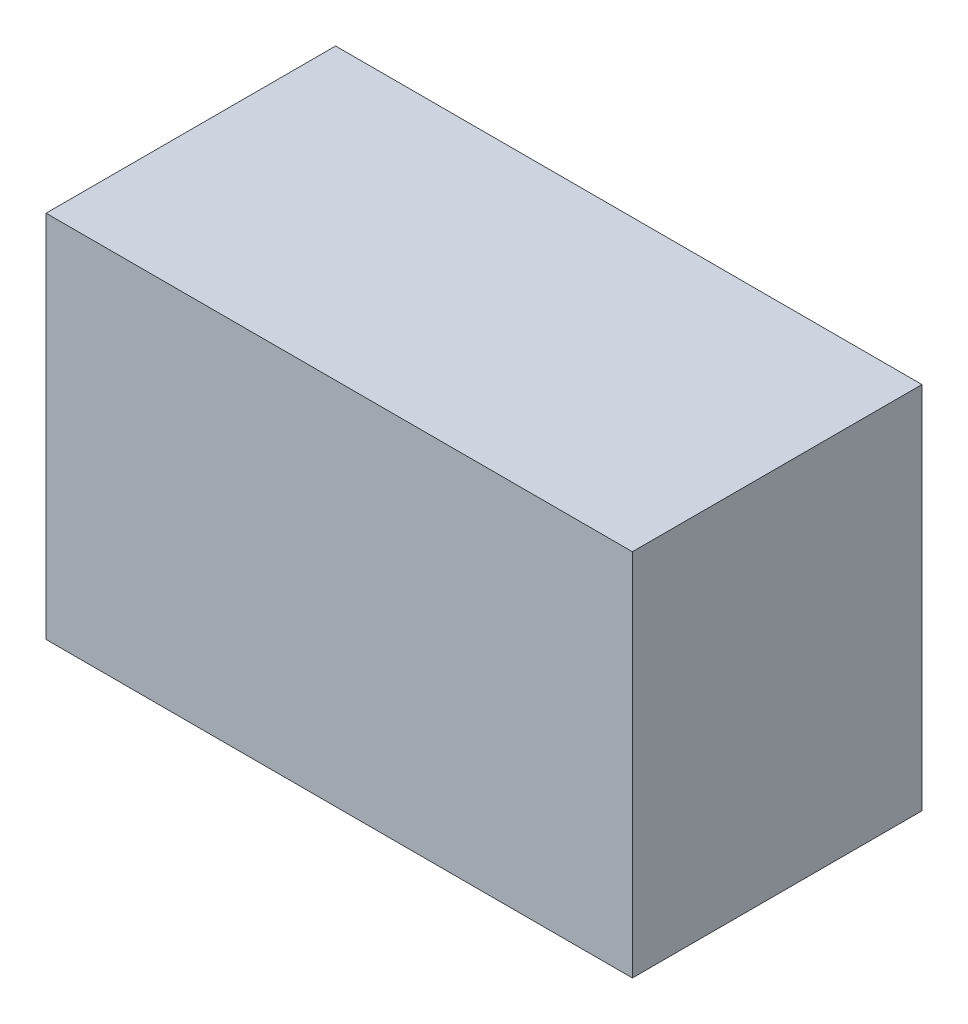
ISO-10303-21;
HEADER;
FILE_DESCRIPTION(('STEP AP214'),'2;1');
FILE_NAME('part.step','',(''),(''),'','','');
FILE_SCHEMA(('AUTOMOTIVE_DESIGN { 1 0 10303 214 1 1 1 1 }'));
ENDSEC;
DATA;
#1=APPLICATION_CONTEXT('core data for automotive mechanical design processes');
#2=APPLICATION_PROTOCOL_DEFINITION('international standard','automotive_design',2000,#1);
#3=PRODUCT_CONTEXT('',#1,'mechanical');
#4=PRODUCT('Part','Part','',(#3));
#5=PRODUCT_RELATED_PRODUCT_CATEGORY('part','',(#4));
#6=PRODUCT_DEFINITION_FORMATION('','',#4);
#7=PRODUCT_DEFINITION_CONTEXT('part definition',#1,'design');
#8=PRODUCT_DEFINITION('design','',#6,#7);
#9=PRODUCT_DEFINITION_SHAPE('','',#8);
#10=(LENGTH_UNIT() NAMED_UNIT(*) SI_UNIT(.MILLI.,.METRE.));
#11=(NAMED_UNIT(*) PLANE_ANGLE_UNIT() SI_UNIT($,.RADIAN.));
#12=(NAMED_UNIT(*) SI_UNIT($,.STERADIAN.) SOLID_ANGLE_UNIT());
#13=UNCERTAINTY_MEASURE_WITH_UNIT(LENGTH_MEASURE(1.E-05),#10,'distance_accuracy_value','');
#14=(GEOMETRIC_REPRESENTATION_CONTEXT(3) GLOBAL_UNCERTAINTY_ASSIGNED_CONTEXT((#13)) GLOBAL_UNIT_ASSIGNED_CONTEXT((#10,
#11,#12)) REPRESENTATION_CONTEXT('',''));
#15=CARTESIAN_POINT('',(0.,0.,0.));
#16=DIRECTION('',(0.,0.,1.));
#17=DIRECTION('',(1.,0.,0.));
#18=AXIS2_PLACEMENT_3D('',#15,#16,#17);
#19=CARTESIAN_POINT('',(4.04999952,-2.54999998,3.99999962));
#20=DIRECTION('',(0.,0.,-1.));
#21=DIRECTION('',(-1.,0.,0.));
#22=AXIS2_PLACEMENT_3D('',#19,#20,#21);
#23=PLANE('',#22);
#24=DIRECTION('',(1.,0.,0.));
#25=VECTOR('',#24,1.);
#26=CARTESIAN_POINT('',(4.04999952,2.54999998,3.99999962));
#27=LINE('',#26,#25);
#28=CARTESIAN_POINT('',(4.04999952,2.54999998,3.99999962));
#29=VERTEX_POINT('',#28);
#30=CARTESIAN_POINT('',(-4.04999952,2.54999998,3.99999962));
#31=VERTEX_POINT('',#30);
#32=EDGE_CURVE('E55',#29,#31,#27,.F.);
#33=ORIENTED_EDGE('',*,*,#32,.T.);
#34=DIRECTION('',(0.,1.,0.));
#35=VECTOR('',#34,1.);
#36=CARTESIAN_POINT('',(-4.04999952,2.54999998,3.99999962));
#37=LINE('',#36,#35);
#38=CARTESIAN_POINT('',(-4.04999952,-2.54999998,3.99999962));
#39=VERTEX_POINT('',#38);
#40=EDGE_CURVE('E57',#31,#39,#37,.F.);
#41=ORIENTED_EDGE('',*,*,#40,.T.);
#42=DIRECTION('',(1.,0.,0.));
#43=VECTOR('',#42,1.);
#44=CARTESIAN_POINT('',(-4.04999952,-2.54999998,3.99999962));
#45=LINE('',#44,#43);
#46=CARTESIAN_POINT('',(4.04999952,-2.54999998,3.99999962));
#47=VERTEX_POINT('',#46);
#48=EDGE_CURVE('E20',#39,#47,#45,.T.);
#49=ORIENTED_EDGE('',*,*,#48,.T.);
#50=DIRECTION('',(0.,1.,0.));
#51=VECTOR('',#50,1.);
#52=CARTESIAN_POINT('',(4.04999952,-2.54999998,3.99999962));
#53=LINE('',#52,#51);
#54=EDGE_CURVE('E80',#47,#29,#53,.T.);
#55=ORIENTED_EDGE('',*,*,#54,.T.);
#56=EDGE_LOOP('',(#33,#41,#49,#55));
#57=FACE_BOUND('',#56,.T.);
#58=ADVANCED_FACE('F17',(#57),#23,.F.);
#59=CARTESIAN_POINT('',(-4.04999952,-2.54999998,0.));
#60=DIRECTION('',(0.,1.,0.));
#61=DIRECTION('',(0.,0.,1.));
#62=AXIS2_PLACEMENT_3D('',#59,#60,#61);
#63=PLANE('',#62);
#64=DIRECTION('',(0.,0.,1.));
#65=VECTOR('',#64,1.);
#66=CARTESIAN_POINT('',(4.04999952,-2.54999998,0.));
#67=LINE('',#66,#65);
#68=CARTESIAN_POINT('',(4.04999952,-2.54999998,0.));
#69=VERTEX_POINT('',#68);
#70=EDGE_CURVE('E68',#69,#47,#67,.T.);
#71=ORIENTED_EDGE('',*,*,#70,.T.);
#72=ORIENTED_EDGE('',*,*,#48,.F.);
#73=DIRECTION('',(0.,0.,-1.));
#74=VECTOR('',#73,1.);
#75=CARTESIAN_POINT('',(-4.04999952,-2.54999998,0.));
#76=LINE('',#75,#74);
#77=CARTESIAN_POINT('',(-4.04999952,-2.54999998,0.));
#78=VERTEX_POINT('',#77);
#79=EDGE_CURVE('E63',#39,#78,#76,.T.);
#80=ORIENTED_EDGE('',*,*,#79,.T.);
#81=DIRECTION('',(-1.,0.,0.));
#82=VECTOR('',#81,1.);
#83=CARTESIAN_POINT('',(4.04999952,-2.54999998,0.));
#84=LINE('',#83,#82);
#85=EDGE_CURVE('E83',#69,#78,#84,.T.);
#86=ORIENTED_EDGE('',*,*,#85,.F.);
#87=EDGE_LOOP('',(#71,#72,#80,#86));
#88=FACE_BOUND('',#87,.T.);
#89=ADVANCED_FACE('F65',(#88),#63,.F.);
#90=CARTESIAN_POINT('',(-4.04999952,2.54999998,0.));
#91=DIRECTION('',(1.,0.,0.));
#92=DIRECTION('',(0.,0.,-1.));
#93=AXIS2_PLACEMENT_3D('',#90,#91,#92);
#94=PLANE('',#93);
#95=ORIENTED_EDGE('',*,*,#79,.F.);
#96=ORIENTED_EDGE('',*,*,#40,.F.);
#97=DIRECTION('',(0.,0.,-1.));
#98=VECTOR('',#97,1.);
#99=CARTESIAN_POINT('',(-4.04999952,2.54999998,0.));
#100=LINE('',#99,#98);
#101=CARTESIAN_POINT('',(-4.04999952,2.54999998,0.));
#102=VERTEX_POINT('',#101);
#103=EDGE_CURVE('E75',#31,#102,#100,.T.);
#104=ORIENTED_EDGE('',*,*,#103,.T.);
#105=DIRECTION('',(0.,1.,0.));
#106=VECTOR('',#105,1.);
#107=CARTESIAN_POINT('',(-4.04999952,-2.54999998,0.));
#108=LINE('',#107,#106);
#109=EDGE_CURVE('E72',#78,#102,#108,.T.);
#110=ORIENTED_EDGE('',*,*,#109,.F.);
#111=EDGE_LOOP('',(#95,#96,#104,#110));
#112=FACE_BOUND('',#111,.T.);
#113=ADVANCED_FACE('F70',(#112),#94,.F.);
#114=CARTESIAN_POINT('',(4.04999952,2.54999998,0.));
#115=DIRECTION('',(0.,-1.,0.));
#116=DIRECTION('',(0.,0.,-1.));
#117=AXIS2_PLACEMENT_3D('',#114,#115,#116);
#118=PLANE('',#117);
#119=ORIENTED_EDGE('',*,*,#103,.F.);
#120=ORIENTED_EDGE('',*,*,#32,.F.);
#121=DIRECTION('',(0.,0.,1.));
#122=VECTOR('',#121,1.);
#123=CARTESIAN_POINT('',(4.04999952,2.54999998,0.));
#124=LINE('',#123,#122);
#125=CARTESIAN_POINT('',(4.04999952,2.54999998,0.));
#126=VERTEX_POINT('',#125);
#127=EDGE_CURVE('E35',#29,#126,#124,.F.);
#128=ORIENTED_EDGE('',*,*,#127,.T.);
#129=DIRECTION('',(-1.,0.,0.));
#130=VECTOR('',#129,1.);
#131=CARTESIAN_POINT('',(4.04999952,2.54999998,0.));
#132=LINE('',#131,#130);
#133=EDGE_CURVE('E26',#102,#126,#132,.F.);
#134=ORIENTED_EDGE('',*,*,#133,.F.);
#135=EDGE_LOOP('',(#119,#120,#128,#134));
#136=FACE_BOUND('',#135,.T.);
#137=ADVANCED_FACE('F89',(#136),#118,.F.);
#138=CARTESIAN_POINT('',(4.04999952,-2.54999998,0.));
#139=DIRECTION('',(-1.,0.,0.));
#140=DIRECTION('',(0.,0.,1.));
#141=AXIS2_PLACEMENT_3D('',#138,#139,#140);
#142=PLANE('',#141);
#143=ORIENTED_EDGE('',*,*,#127,.F.);
#144=ORIENTED_EDGE('',*,*,#54,.F.);
#145=ORIENTED_EDGE('',*,*,#70,.F.);
#146=DIRECTION('',(0.,1.,0.));
#147=VECTOR('',#146,1.);
#148=CARTESIAN_POINT('',(4.04999952,-2.54999998,0.));
#149=LINE('',#148,#147);
#150=EDGE_CURVE('E11',#126,#69,#149,.F.);
#151=ORIENTED_EDGE('',*,*,#150,.F.);
#152=EDGE_LOOP('',(#143,#144,#145,#151));
#153=FACE_BOUND('',#152,.T.);
#154=ADVANCED_FACE('F91',(#153),#142,.F.);
#155=CARTESIAN_POINT('',(4.04999952,-2.54999998,0.));
#156=DIRECTION('',(0.,0.,-1.));
#157=DIRECTION('',(-1.,0.,0.));
#158=AXIS2_PLACEMENT_3D('',#155,#156,#157);
#159=PLANE('',#158);
#160=ORIENTED_EDGE('',*,*,#133,.T.);
#161=ORIENTED_EDGE('',*,*,#150,.T.);
#162=ORIENTED_EDGE('',*,*,#85,.T.);
#163=ORIENTED_EDGE('',*,*,#109,.T.);
#164=EDGE_LOOP('',(#160,#161,#162,#163));
#165=FACE_BOUND('',#164,.T.);
#166=ADVANCED_FACE('F88',(#165),#159,.T.);
#167=CLOSED_SHELL('',(#58,#89,#113,#137,#154,#166));
#168=MANIFOLD_SOLID_BREP('B1',#167);
#169=ADVANCED_BREP_SHAPE_REPRESENTATION('',(#18,#168),#14);
#170=SHAPE_DEFINITION_REPRESENTATION(#9,#169);
ENDSEC;
END-ISO-10303-21;
